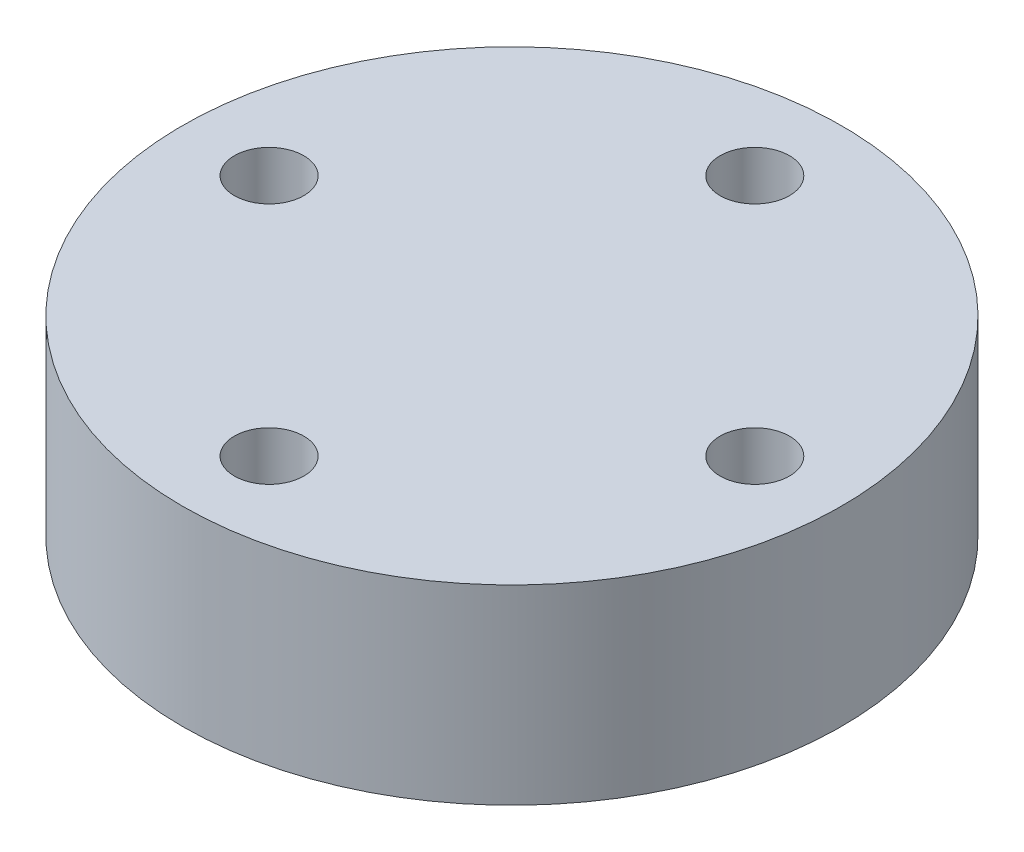
ISO-10303-21;
HEADER;
FILE_DESCRIPTION(('STEP AP214'),'2;1');
FILE_NAME('part.step','',(''),(''),'','','');
FILE_SCHEMA(('AUTOMOTIVE_DESIGN { 1 0 10303 214 1 1 1 1 }'));
ENDSEC;
DATA;
#1=APPLICATION_CONTEXT('core data for automotive mechanical design processes');
#2=APPLICATION_PROTOCOL_DEFINITION('international standard','automotive_design',2000,#1);
#3=PRODUCT_CONTEXT('',#1,'mechanical');
#4=PRODUCT('Part','Part','',(#3));
#5=PRODUCT_RELATED_PRODUCT_CATEGORY('part','',(#4));
#6=PRODUCT_DEFINITION_FORMATION('','',#4);
#7=PRODUCT_DEFINITION_CONTEXT('part definition',#1,'design');
#8=PRODUCT_DEFINITION('design','',#6,#7);
#9=PRODUCT_DEFINITION_SHAPE('','',#8);
#10=(LENGTH_UNIT() NAMED_UNIT(*) SI_UNIT(.MILLI.,.METRE.));
#11=(NAMED_UNIT(*) PLANE_ANGLE_UNIT() SI_UNIT($,.RADIAN.));
#12=(NAMED_UNIT(*) SI_UNIT($,.STERADIAN.) SOLID_ANGLE_UNIT());
#13=UNCERTAINTY_MEASURE_WITH_UNIT(LENGTH_MEASURE(1.E-05),#10,'distance_accuracy_value','');
#14=(GEOMETRIC_REPRESENTATION_CONTEXT(3) GLOBAL_UNCERTAINTY_ASSIGNED_CONTEXT((#13)) GLOBAL_UNIT_ASSIGNED_CONTEXT((#10,
#11,#12)) REPRESENTATION_CONTEXT('',''));
#15=CARTESIAN_POINT('',(0.,0.,0.));
#16=DIRECTION('',(0.,0.,1.));
#17=DIRECTION('',(1.,0.,0.));
#18=AXIS2_PLACEMENT_3D('',#15,#16,#17);
#19=CARTESIAN_POINT('',(0.,5.5,0.));
#20=DIRECTION('',(0.,1.,0.));
#21=DIRECTION('',(0.,0.,1.));
#22=AXIS2_PLACEMENT_3D('',#19,#20,#21);
#23=PLANE('',#22);
#24=CARTESIAN_POINT('',(0.,5.5,7.));
#25=DIRECTION('',(0.,1.,0.));
#26=DIRECTION('',(0.,0.,1.));
#27=AXIS2_PLACEMENT_3D('',#24,#25,#26);
#28=CIRCLE('',#27,0.999999999999999);
#29=CARTESIAN_POINT('',(0.,5.5,8.));
#30=VERTEX_POINT('',#29);
#31=EDGE_CURVE('E55',#30,#30,#28,.T.);
#32=ORIENTED_EDGE('',*,*,#31,.F.);
#33=EDGE_LOOP('',(#32));
#34=FACE_BOUND('',#33,.T.);
#35=CARTESIAN_POINT('',(0.,5.5,-7.));
#36=DIRECTION('',(0.,1.,0.));
#37=DIRECTION('',(0.,0.,1.));
#38=AXIS2_PLACEMENT_3D('',#35,#36,#37);
#39=CIRCLE('',#38,0.999999999999999);
#40=CARTESIAN_POINT('',(0.,5.5,-6.));
#41=VERTEX_POINT('',#40);
#42=EDGE_CURVE('E44',#41,#41,#39,.T.);
#43=ORIENTED_EDGE('',*,*,#42,.F.);
#44=EDGE_LOOP('',(#43));
#45=FACE_BOUND('',#44,.T.);
#46=CARTESIAN_POINT('',(0.,5.5,0.));
#47=DIRECTION('',(0.,1.,0.));
#48=DIRECTION('',(0.,0.,1.));
#49=AXIS2_PLACEMENT_3D('',#46,#47,#48);
#50=CIRCLE('',#49,9.5);
#51=CARTESIAN_POINT('',(0.,5.5,9.5));
#52=VERTEX_POINT('',#51);
#53=EDGE_CURVE('E10',#52,#52,#50,.T.);
#54=ORIENTED_EDGE('',*,*,#53,.T.);
#55=EDGE_LOOP('',(#54));
#56=FACE_BOUND('',#55,.T.);
#57=CARTESIAN_POINT('',(7.,5.5,0.));
#58=DIRECTION('',(0.,1.,0.));
#59=DIRECTION('',(0.,0.,1.));
#60=AXIS2_PLACEMENT_3D('',#57,#58,#59);
#61=CIRCLE('',#60,1.);
#62=CARTESIAN_POINT('',(7.,5.5,1.));
#63=VERTEX_POINT('',#62);
#64=EDGE_CURVE('E49',#63,#63,#61,.T.);
#65=ORIENTED_EDGE('',*,*,#64,.F.);
#66=EDGE_LOOP('',(#65));
#67=FACE_BOUND('',#66,.T.);
#68=CARTESIAN_POINT('',(-7.,5.5,0.));
#69=DIRECTION('',(0.,1.,0.));
#70=DIRECTION('',(0.,0.,1.));
#71=AXIS2_PLACEMENT_3D('',#68,#69,#70);
#72=CIRCLE('',#71,0.999999999999999);
#73=CARTESIAN_POINT('',(-7.,5.5,0.999999999999999));
#74=VERTEX_POINT('',#73);
#75=EDGE_CURVE('E61',#74,#74,#72,.T.);
#76=ORIENTED_EDGE('',*,*,#75,.F.);
#77=EDGE_LOOP('',(#76));
#78=FACE_BOUND('',#77,.T.);
#79=ADVANCED_FACE('F33',(#34,#45,#56,#67,#78),#23,.T.);
#80=CARTESIAN_POINT('',(0.,0.,0.));
#81=DIRECTION('',(0.,1.,0.));
#82=DIRECTION('',(0.,0.,1.));
#83=AXIS2_PLACEMENT_3D('',#80,#81,#82);
#84=PLANE('',#83);
#85=CARTESIAN_POINT('',(0.,0.,0.));
#86=DIRECTION('',(0.,1.,0.));
#87=DIRECTION('',(0.,0.,1.));
#88=AXIS2_PLACEMENT_3D('',#85,#86,#87);
#89=CIRCLE('',#88,9.5);
#90=CARTESIAN_POINT('',(0.,0.,9.5));
#91=VERTEX_POINT('',#90);
#92=EDGE_CURVE('E37',#91,#91,#89,.T.);
#93=ORIENTED_EDGE('',*,*,#92,.F.);
#94=EDGE_LOOP('',(#93));
#95=FACE_BOUND('',#94,.T.);
#96=CARTESIAN_POINT('',(0.,0.,-7.));
#97=DIRECTION('',(0.,1.,0.));
#98=DIRECTION('',(0.,0.,1.));
#99=AXIS2_PLACEMENT_3D('',#96,#97,#98);
#100=CIRCLE('',#99,0.999999999999999);
#101=CARTESIAN_POINT('',(0.,0.,-6.));
#102=VERTEX_POINT('',#101);
#103=EDGE_CURVE('E46',#102,#102,#100,.T.);
#104=ORIENTED_EDGE('',*,*,#103,.T.);
#105=EDGE_LOOP('',(#104));
#106=FACE_BOUND('',#105,.T.);
#107=CARTESIAN_POINT('',(7.,0.,0.));
#108=DIRECTION('',(0.,1.,0.));
#109=DIRECTION('',(0.,0.,1.));
#110=AXIS2_PLACEMENT_3D('',#107,#108,#109);
#111=CIRCLE('',#110,1.);
#112=CARTESIAN_POINT('',(7.,0.,1.));
#113=VERTEX_POINT('',#112);
#114=EDGE_CURVE('E52',#113,#113,#111,.T.);
#115=ORIENTED_EDGE('',*,*,#114,.T.);
#116=EDGE_LOOP('',(#115));
#117=FACE_BOUND('',#116,.T.);
#118=CARTESIAN_POINT('',(0.,0.,7.));
#119=DIRECTION('',(0.,1.,0.));
#120=DIRECTION('',(0.,0.,1.));
#121=AXIS2_PLACEMENT_3D('',#118,#119,#120);
#122=CIRCLE('',#121,0.999999999999999);
#123=CARTESIAN_POINT('',(0.,0.,8.));
#124=VERTEX_POINT('',#123);
#125=EDGE_CURVE('E58',#124,#124,#122,.T.);
#126=ORIENTED_EDGE('',*,*,#125,.T.);
#127=EDGE_LOOP('',(#126));
#128=FACE_BOUND('',#127,.T.);
#129=CARTESIAN_POINT('',(-7.,0.,0.));
#130=DIRECTION('',(0.,1.,0.));
#131=DIRECTION('',(0.,0.,1.));
#132=AXIS2_PLACEMENT_3D('',#129,#130,#131);
#133=CIRCLE('',#132,0.999999999999999);
#134=CARTESIAN_POINT('',(-7.,0.,0.999999999999999));
#135=VERTEX_POINT('',#134);
#136=EDGE_CURVE('E64',#135,#135,#133,.T.);
#137=ORIENTED_EDGE('',*,*,#136,.T.);
#138=EDGE_LOOP('',(#137));
#139=FACE_BOUND('',#138,.T.);
#140=ADVANCED_FACE('F74',(#95,#106,#117,#128,#139),#84,.F.);
#141=CARTESIAN_POINT('',(0.,5.5,0.));
#142=DIRECTION('',(0.,-1.,0.));
#143=DIRECTION('',(0.,0.,-1.));
#144=AXIS2_PLACEMENT_3D('',#141,#142,#143);
#145=CYLINDRICAL_SURFACE('',#144,9.5);
#146=ORIENTED_EDGE('',*,*,#53,.F.);
#147=EDGE_LOOP('',(#146));
#148=FACE_BOUND('',#147,.T.);
#149=ORIENTED_EDGE('',*,*,#92,.T.);
#150=EDGE_LOOP('',(#149));
#151=FACE_BOUND('',#150,.T.);
#152=ADVANCED_FACE('F35',(#148,#151),#145,.T.);
#153=CARTESIAN_POINT('',(0.,5.5,-7.));
#154=DIRECTION('',(0.,-1.,0.));
#155=DIRECTION('',(0.,0.,-1.));
#156=AXIS2_PLACEMENT_3D('',#153,#154,#155);
#157=CYLINDRICAL_SURFACE('',#156,0.999999999999999);
#158=ORIENTED_EDGE('',*,*,#42,.T.);
#159=EDGE_LOOP('',(#158));
#160=FACE_BOUND('',#159,.T.);
#161=ORIENTED_EDGE('',*,*,#103,.F.);
#162=EDGE_LOOP('',(#161));
#163=FACE_BOUND('',#162,.T.);
#164=ADVANCED_FACE('F84',(#160,#163),#157,.F.);
#165=CARTESIAN_POINT('',(7.,5.5,0.));
#166=DIRECTION('',(0.,-1.,0.));
#167=DIRECTION('',(0.,0.,-1.));
#168=AXIS2_PLACEMENT_3D('',#165,#166,#167);
#169=CYLINDRICAL_SURFACE('',#168,1.);
#170=ORIENTED_EDGE('',*,*,#64,.T.);
#171=EDGE_LOOP('',(#170));
#172=FACE_BOUND('',#171,.T.);
#173=ORIENTED_EDGE('',*,*,#114,.F.);
#174=EDGE_LOOP('',(#173));
#175=FACE_BOUND('',#174,.T.);
#176=ADVANCED_FACE('F87',(#172,#175),#169,.F.);
#177=CARTESIAN_POINT('',(0.,5.5,7.));
#178=DIRECTION('',(0.,-1.,0.));
#179=DIRECTION('',(0.,0.,-1.));
#180=AXIS2_PLACEMENT_3D('',#177,#178,#179);
#181=CYLINDRICAL_SURFACE('',#180,0.999999999999999);
#182=ORIENTED_EDGE('',*,*,#31,.T.);
#183=EDGE_LOOP('',(#182));
#184=FACE_BOUND('',#183,.T.);
#185=ORIENTED_EDGE('',*,*,#125,.F.);
#186=EDGE_LOOP('',(#185));
#187=FACE_BOUND('',#186,.T.);
#188=ADVANCED_FACE('F91',(#184,#187),#181,.F.);
#189=CARTESIAN_POINT('',(-7.,5.5,0.));
#190=DIRECTION('',(0.,-1.,0.));
#191=DIRECTION('',(0.,0.,-1.));
#192=AXIS2_PLACEMENT_3D('',#189,#190,#191);
#193=CYLINDRICAL_SURFACE('',#192,0.999999999999999);
#194=ORIENTED_EDGE('',*,*,#75,.T.);
#195=EDGE_LOOP('',(#194));
#196=FACE_BOUND('',#195,.T.);
#197=ORIENTED_EDGE('',*,*,#136,.F.);
#198=EDGE_LOOP('',(#197));
#199=FACE_BOUND('',#198,.T.);
#200=ADVANCED_FACE('F70',(#196,#199),#193,.F.);
#201=CLOSED_SHELL('',(#79,#140,#152,#164,#176,#188,#200));
#202=MANIFOLD_SOLID_BREP('B2',#201);
#203=ADVANCED_BREP_SHAPE_REPRESENTATION('',(#18,#202),#14);
#204=SHAPE_DEFINITION_REPRESENTATION(#9,#203);
ENDSEC;
END-ISO-10303-21;
